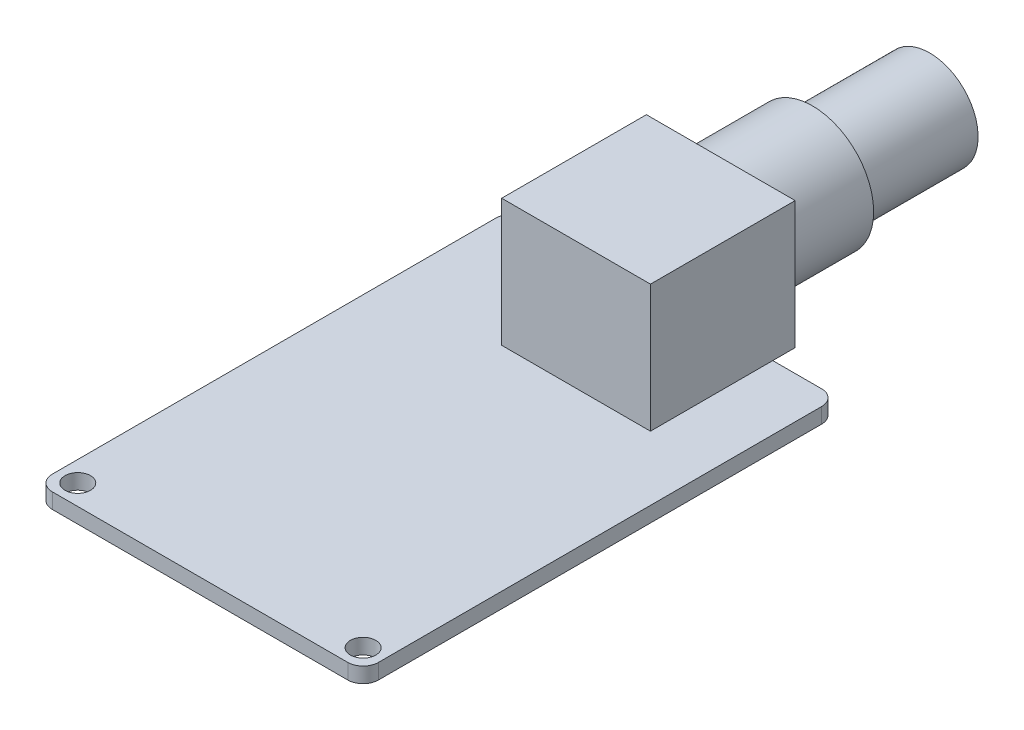
ISO-10303-21;
HEADER;
FILE_DESCRIPTION(('STEP AP214'),'2;1');
FILE_NAME('part.step','',(''),(''),'','','');
FILE_SCHEMA(('AUTOMOTIVE_DESIGN { 1 0 10303 214 1 1 1 1 }'));
ENDSEC;
DATA;
#1=APPLICATION_CONTEXT('core data for automotive mechanical design processes');
#2=APPLICATION_PROTOCOL_DEFINITION('international standard','automotive_design',2000,#1);
#3=PRODUCT_CONTEXT('',#1,'mechanical');
#4=PRODUCT('Part','Part','',(#3));
#5=PRODUCT_RELATED_PRODUCT_CATEGORY('part','',(#4));
#6=PRODUCT_DEFINITION_FORMATION('','',#4);
#7=PRODUCT_DEFINITION_CONTEXT('part definition',#1,'design');
#8=PRODUCT_DEFINITION('design','',#6,#7);
#9=PRODUCT_DEFINITION_SHAPE('','',#8);
#10=(LENGTH_UNIT() NAMED_UNIT(*) SI_UNIT(.MILLI.,.METRE.));
#11=(NAMED_UNIT(*) PLANE_ANGLE_UNIT() SI_UNIT($,.RADIAN.));
#12=(NAMED_UNIT(*) SI_UNIT($,.STERADIAN.) SOLID_ANGLE_UNIT());
#13=UNCERTAINTY_MEASURE_WITH_UNIT(LENGTH_MEASURE(1.E-05),#10,'distance_accuracy_value','');
#14=(GEOMETRIC_REPRESENTATION_CONTEXT(3) GLOBAL_UNCERTAINTY_ASSIGNED_CONTEXT((#13)) GLOBAL_UNIT_ASSIGNED_CONTEXT((#10,
#11,#12)) REPRESENTATION_CONTEXT('',''));
#15=CARTESIAN_POINT('',(0.,0.,0.));
#16=DIRECTION('',(0.,0.,1.));
#17=DIRECTION('',(1.,0.,0.));
#18=AXIS2_PLACEMENT_3D('',#15,#16,#17);
#19=CARTESIAN_POINT('',(-36.6409090909091,25.1,17.7));
#20=DIRECTION('',(0.,1.,0.));
#21=DIRECTION('',(0.,0.,1.));
#22=AXIS2_PLACEMENT_3D('',#19,#20,#21);
#23=PLANE('',#22);
#24=DIRECTION('',(1.,0.,0.));
#25=VECTOR('',#24,1.);
#26=CARTESIAN_POINT('',(-17.2409090909091,25.1,5.69742249083508));
#27=LINE('',#26,#25);
#28=CARTESIAN_POINT('',(-36.6409090909091,25.1,5.69742249083508));
#29=VERTEX_POINT('',#28);
#30=CARTESIAN_POINT('',(-22.0409090909091,25.1,5.69742249083508));
#31=VERTEX_POINT('',#30);
#32=EDGE_CURVE('E11',#29,#31,#27,.T.);
#33=ORIENTED_EDGE('',*,*,#32,.F.);
#34=DIRECTION('',(0.,0.,-1.));
#35=VECTOR('',#34,1.);
#36=CARTESIAN_POINT('',(-36.6409090909091,25.1,17.7));
#37=LINE('',#36,#35);
#38=CARTESIAN_POINT('',(-36.6409090909091,25.1,3.5));
#39=VERTEX_POINT('',#38);
#40=EDGE_CURVE('E191',#29,#39,#37,.T.);
#41=ORIENTED_EDGE('',*,*,#40,.T.);
#42=DIRECTION('',(1.,0.,0.));
#43=VECTOR('',#42,1.);
#44=CARTESIAN_POINT('',(-36.6409090909091,25.1,3.5));
#45=LINE('',#44,#43);
#46=CARTESIAN_POINT('',(-22.0409090909091,25.1,3.5));
#47=VERTEX_POINT('',#46);
#48=EDGE_CURVE('E167',#39,#47,#45,.T.);
#49=ORIENTED_EDGE('',*,*,#48,.T.);
#50=DIRECTION('',(0.,0.,-1.));
#51=VECTOR('',#50,1.);
#52=CARTESIAN_POINT('',(-22.0409090909091,25.1,17.7));
#53=LINE('',#52,#51);
#54=EDGE_CURVE('E188',#31,#47,#53,.T.);
#55=ORIENTED_EDGE('',*,*,#54,.F.);
#56=EDGE_LOOP('',(#33,#41,#49,#55));
#57=FACE_BOUND('',#56,.T.);
#58=ADVANCED_FACE('F32',(#57),#23,.F.);
#59=CARTESIAN_POINT('',(-29.3409090909091,31.5,3.5));
#60=DIRECTION('',(0.,0.,-1.));
#61=DIRECTION('',(-1.,0.,0.));
#62=AXIS2_PLACEMENT_3D('',#59,#60,#61);
#63=CYLINDRICAL_SURFACE('',#62,6.);
#64=CARTESIAN_POINT('',(-29.3409090909091,31.5,3.5));
#65=DIRECTION('',(0.,0.,1.));
#66=DIRECTION('',(1.,0.,0.));
#67=AXIS2_PLACEMENT_3D('',#64,#65,#66);
#68=CIRCLE('',#67,6.);
#69=CARTESIAN_POINT('',(-23.3409090909091,31.5,3.5));
#70=VERTEX_POINT('',#69);
#71=EDGE_CURVE('E36',#70,#70,#68,.T.);
#72=ORIENTED_EDGE('',*,*,#71,.F.);
#73=EDGE_LOOP('',(#72));
#74=FACE_BOUND('',#73,.T.);
#75=CARTESIAN_POINT('',(-29.3409090909091,31.5,-5.5));
#76=DIRECTION('',(0.,0.,1.));
#77=DIRECTION('',(1.,0.,0.));
#78=AXIS2_PLACEMENT_3D('',#75,#76,#77);
#79=CIRCLE('',#78,6.);
#80=CARTESIAN_POINT('',(-23.3409090909091,31.5,-5.5));
#81=VERTEX_POINT('',#80);
#82=EDGE_CURVE('E204',#81,#81,#79,.T.);
#83=ORIENTED_EDGE('',*,*,#82,.T.);
#84=EDGE_LOOP('',(#83));
#85=FACE_BOUND('',#84,.T.);
#86=ADVANCED_FACE('F34',(#74,#85),#63,.T.);
#87=CARTESIAN_POINT('',(-29.3409090909091,31.5,-5.5));
#88=DIRECTION('',(0.,0.,1.));
#89=DIRECTION('',(1.,0.,0.));
#90=AXIS2_PLACEMENT_3D('',#87,#88,#89);
#91=PLANE('',#90);
#92=CARTESIAN_POINT('',(-29.3409090909091,31.5,-5.5));
#93=DIRECTION('',(0.,0.,-1.));
#94=DIRECTION('',(-1.,0.,0.));
#95=AXIS2_PLACEMENT_3D('',#92,#93,#94);
#96=CIRCLE('',#95,4.75000000000001);
#97=CARTESIAN_POINT('',(-34.0909090909091,31.5,-5.5));
#98=VERTEX_POINT('',#97);
#99=EDGE_CURVE('E41',#98,#98,#96,.T.);
#100=ORIENTED_EDGE('',*,*,#99,.F.);
#101=EDGE_LOOP('',(#100));
#102=FACE_BOUND('',#101,.T.);
#103=ORIENTED_EDGE('',*,*,#82,.F.);
#104=EDGE_LOOP('',(#103));
#105=FACE_BOUND('',#104,.T.);
#106=ADVANCED_FACE('F216',(#102,#105),#91,.F.);
#107=CARTESIAN_POINT('',(-29.3409090909091,31.5,-17.));
#108=DIRECTION('',(0.,0.,1.));
#109=DIRECTION('',(1.,0.,0.));
#110=AXIS2_PLACEMENT_3D('',#107,#108,#109);
#111=CYLINDRICAL_SURFACE('',#110,4.75000000000001);
#112=CARTESIAN_POINT('',(-29.3409090909091,31.5,-17.));
#113=DIRECTION('',(0.,0.,-1.));
#114=DIRECTION('',(-1.,0.,0.));
#115=AXIS2_PLACEMENT_3D('',#112,#113,#114);
#116=CIRCLE('',#115,4.75000000000001);
#117=CARTESIAN_POINT('',(-34.0909090909091,31.5,-17.));
#118=VERTEX_POINT('',#117);
#119=EDGE_CURVE('E199',#118,#118,#116,.T.);
#120=ORIENTED_EDGE('',*,*,#119,.F.);
#121=EDGE_LOOP('',(#120));
#122=FACE_BOUND('',#121,.T.);
#123=ORIENTED_EDGE('',*,*,#99,.T.);
#124=EDGE_LOOP('',(#123));
#125=FACE_BOUND('',#124,.T.);
#126=ADVANCED_FACE('F221',(#122,#125),#111,.T.);
#127=CARTESIAN_POINT('',(-29.3409090909091,31.5,-17.));
#128=DIRECTION('',(0.,0.,-1.));
#129=DIRECTION('',(-1.,0.,0.));
#130=AXIS2_PLACEMENT_3D('',#127,#128,#129);
#131=PLANE('',#130);
#132=CARTESIAN_POINT('',(-29.3409090909091,31.5,-17.));
#133=DIRECTION('',(0.,0.,-1.));
#134=DIRECTION('',(-1.,0.,0.));
#135=AXIS2_PLACEMENT_3D('',#132,#133,#134);
#136=CIRCLE('',#135,4.25000000000001);
#137=CARTESIAN_POINT('',(-33.5909090909091,31.5,-17.));
#138=VERTEX_POINT('',#137);
#139=EDGE_CURVE('E195',#138,#138,#136,.T.);
#140=ORIENTED_EDGE('',*,*,#139,.F.);
#141=EDGE_LOOP('',(#140));
#142=FACE_BOUND('',#141,.T.);
#143=ORIENTED_EDGE('',*,*,#119,.T.);
#144=EDGE_LOOP('',(#143));
#145=FACE_BOUND('',#144,.T.);
#146=ADVANCED_FACE('F241',(#142,#145),#131,.T.);
#147=CARTESIAN_POINT('',(-29.3409090909091,31.5,-5.5));
#148=DIRECTION('',(0.,0.,-1.));
#149=DIRECTION('',(-1.,0.,0.));
#150=AXIS2_PLACEMENT_3D('',#147,#148,#149);
#151=CYLINDRICAL_SURFACE('',#150,4.25000000000001);
#152=CARTESIAN_POINT('',(-29.3409090909091,31.5,-5.5));
#153=DIRECTION('',(0.,0.,-1.));
#154=DIRECTION('',(-1.,0.,0.));
#155=AXIS2_PLACEMENT_3D('',#152,#153,#154);
#156=CIRCLE('',#155,4.25000000000001);
#157=CARTESIAN_POINT('',(-33.5909090909091,31.5,-5.5));
#158=VERTEX_POINT('',#157);
#159=EDGE_CURVE('E196',#158,#158,#156,.T.);
#160=ORIENTED_EDGE('',*,*,#159,.F.);
#161=EDGE_LOOP('',(#160));
#162=FACE_BOUND('',#161,.T.);
#163=ORIENTED_EDGE('',*,*,#139,.T.);
#164=EDGE_LOOP('',(#163));
#165=FACE_BOUND('',#164,.T.);
#166=ADVANCED_FACE('F237',(#162,#165),#151,.F.);
#167=CARTESIAN_POINT('',(-29.3409090909091,31.5,-5.5));
#168=DIRECTION('',(0.,0.,-1.));
#169=DIRECTION('',(-1.,0.,0.));
#170=AXIS2_PLACEMENT_3D('',#167,#168,#169);
#171=PLANE('',#170);
#172=ORIENTED_EDGE('',*,*,#159,.T.);
#173=EDGE_LOOP('',(#172));
#174=FACE_BOUND('',#173,.T.);
#175=ADVANCED_FACE('F233',(#174),#171,.T.);
#176=CARTESIAN_POINT('',(-36.6409090909091,37.6,17.7));
#177=DIRECTION('',(1.,0.,0.));
#178=DIRECTION('',(0.,1.,0.));
#179=AXIS2_PLACEMENT_3D('',#176,#177,#178);
#180=PLANE('',#179);
#181=DIRECTION('',(0.,-1.,0.));
#182=VECTOR('',#181,1.);
#183=CARTESIAN_POINT('',(-36.6409090909091,37.6,3.5));
#184=LINE('',#183,#182);
#185=CARTESIAN_POINT('',(-36.6409090909091,37.6,3.5));
#186=VERTEX_POINT('',#185);
#187=EDGE_CURVE('E164',#186,#39,#184,.T.);
#188=ORIENTED_EDGE('',*,*,#187,.T.);
#189=ORIENTED_EDGE('',*,*,#40,.F.);
#190=CARTESIAN_POINT('',(-36.6409090909091,25.1,17.7));
#191=VERTEX_POINT('',#190);
#192=EDGE_CURVE('E192',#191,#29,#37,.T.);
#193=ORIENTED_EDGE('',*,*,#192,.F.);
#194=DIRECTION('',(0.,-1.,0.));
#195=VECTOR('',#194,1.);
#196=CARTESIAN_POINT('',(-36.6409090909091,37.6,17.7));
#197=LINE('',#196,#195);
#198=CARTESIAN_POINT('',(-36.6409090909091,37.6,17.7));
#199=VERTEX_POINT('',#198);
#200=EDGE_CURVE('E83',#199,#191,#197,.T.);
#201=ORIENTED_EDGE('',*,*,#200,.F.);
#202=DIRECTION('',(0.,0.,-1.));
#203=VECTOR('',#202,1.);
#204=CARTESIAN_POINT('',(-36.6409090909091,37.6,17.7));
#205=LINE('',#204,#203);
#206=EDGE_CURVE('E178',#199,#186,#205,.T.);
#207=ORIENTED_EDGE('',*,*,#206,.T.);
#208=EDGE_LOOP('',(#188,#189,#193,#201,#207));
#209=FACE_BOUND('',#208,.T.);
#210=ADVANCED_FACE('F230',(#209),#180,.F.);
#211=CARTESIAN_POINT('',(-22.0409090909091,37.6,17.7));
#212=DIRECTION('',(-1.,0.,0.));
#213=DIRECTION('',(0.,0.,1.));
#214=AXIS2_PLACEMENT_3D('',#211,#212,#213);
#215=PLANE('',#214);
#216=DIRECTION('',(0.,1.,0.));
#217=VECTOR('',#216,1.);
#218=CARTESIAN_POINT('',(-22.0409090909091,37.6,3.5));
#219=LINE('',#218,#217);
#220=CARTESIAN_POINT('',(-22.0409090909091,37.6,3.5));
#221=VERTEX_POINT('',#220);
#222=EDGE_CURVE('E182',#47,#221,#219,.T.);
#223=ORIENTED_EDGE('',*,*,#222,.T.);
#224=DIRECTION('',(0.,0.,-1.));
#225=VECTOR('',#224,1.);
#226=CARTESIAN_POINT('',(-22.0409090909091,37.6,17.7));
#227=LINE('',#226,#225);
#228=CARTESIAN_POINT('',(-22.0409090909091,37.6,17.7));
#229=VERTEX_POINT('',#228);
#230=EDGE_CURVE('E186',#229,#221,#227,.T.);
#231=ORIENTED_EDGE('',*,*,#230,.F.);
#232=DIRECTION('',(0.,1.,0.));
#233=VECTOR('',#232,1.);
#234=CARTESIAN_POINT('',(-22.0409090909091,37.6,17.7));
#235=LINE('',#234,#233);
#236=CARTESIAN_POINT('',(-22.0409090909091,25.1,17.7));
#237=VERTEX_POINT('',#236);
#238=EDGE_CURVE('E176',#237,#229,#235,.T.);
#239=ORIENTED_EDGE('',*,*,#238,.F.);
#240=EDGE_CURVE('E189',#237,#31,#53,.T.);
#241=ORIENTED_EDGE('',*,*,#240,.T.);
#242=ORIENTED_EDGE('',*,*,#54,.T.);
#243=EDGE_LOOP('',(#223,#231,#239,#241,#242));
#244=FACE_BOUND('',#243,.T.);
#245=ADVANCED_FACE('F228',(#244),#215,.F.);
#246=CARTESIAN_POINT('',(-36.6409090909091,37.6,17.7));
#247=DIRECTION('',(0.,-1.,0.));
#248=DIRECTION('',(0.,0.,-1.));
#249=AXIS2_PLACEMENT_3D('',#246,#247,#248);
#250=PLANE('',#249);
#251=DIRECTION('',(-1.,0.,0.));
#252=VECTOR('',#251,1.);
#253=CARTESIAN_POINT('',(-36.6409090909091,37.6,3.5));
#254=LINE('',#253,#252);
#255=EDGE_CURVE('E78',#221,#186,#254,.T.);
#256=ORIENTED_EDGE('',*,*,#255,.T.);
#257=ORIENTED_EDGE('',*,*,#206,.F.);
#258=DIRECTION('',(-1.,0.,0.));
#259=VECTOR('',#258,1.);
#260=CARTESIAN_POINT('',(-36.6409090909091,37.6,17.7));
#261=LINE('',#260,#259);
#262=EDGE_CURVE('E58',#229,#199,#261,.T.);
#263=ORIENTED_EDGE('',*,*,#262,.F.);
#264=ORIENTED_EDGE('',*,*,#230,.T.);
#265=EDGE_LOOP('',(#256,#257,#263,#264));
#266=FACE_BOUND('',#265,.T.);
#267=ADVANCED_FACE('F280',(#266),#250,.F.);
#268=CARTESIAN_POINT('',(0.,0.,17.7));
#269=DIRECTION('',(0.,0.,1.));
#270=DIRECTION('',(1.,0.,0.));
#271=AXIS2_PLACEMENT_3D('',#268,#269,#270);
#272=PLANE('',#271);
#273=ORIENTED_EDGE('',*,*,#200,.T.);
#274=DIRECTION('',(1.,0.,0.));
#275=VECTOR('',#274,1.);
#276=CARTESIAN_POINT('',(-36.6409090909091,25.1,17.7));
#277=LINE('',#276,#275);
#278=EDGE_CURVE('E174',#191,#237,#277,.T.);
#279=ORIENTED_EDGE('',*,*,#278,.T.);
#280=ORIENTED_EDGE('',*,*,#238,.T.);
#281=ORIENTED_EDGE('',*,*,#262,.T.);
#282=EDGE_LOOP('',(#273,#279,#280,#281));
#283=FACE_BOUND('',#282,.T.);
#284=ADVANCED_FACE('F287',(#283),#272,.T.);
#285=CARTESIAN_POINT('',(0.,0.,3.5));
#286=DIRECTION('',(0.,0.,1.));
#287=DIRECTION('',(1.,0.,0.));
#288=AXIS2_PLACEMENT_3D('',#285,#286,#287);
#289=PLANE('',#288);
#290=ORIENTED_EDGE('',*,*,#71,.T.);
#291=EDGE_LOOP('',(#290));
#292=FACE_BOUND('',#291,.T.);
#293=ORIENTED_EDGE('',*,*,#187,.F.);
#294=ORIENTED_EDGE('',*,*,#255,.F.);
#295=ORIENTED_EDGE('',*,*,#222,.F.);
#296=ORIENTED_EDGE('',*,*,#48,.F.);
#297=EDGE_LOOP('',(#293,#294,#295,#296));
#298=FACE_BOUND('',#297,.T.);
#299=ADVANCED_FACE('F212',(#292,#298),#289,.F.);
#300=CARTESIAN_POINT('',(-17.2409090909091,23.6,50.6974224908351));
#301=DIRECTION('',(0.,-1.,0.));
#302=DIRECTION('',(0.,0.,-1.));
#303=AXIS2_PLACEMENT_3D('',#300,#301,#302);
#304=PLANE('',#303);
#305=CARTESIAN_POINT('',(-17.7409090909091,23.6,50.1974224908351));
#306=DIRECTION('',(0.,-1.,0.));
#307=DIRECTION('',(0.,0.,-1.));
#308=AXIS2_PLACEMENT_3D('',#305,#306,#307);
#309=CIRCLE('',#308,1.25);
#310=CARTESIAN_POINT('',(-17.7409090909091,23.6,48.9474224908351));
#311=VERTEX_POINT('',#310);
#312=EDGE_CURVE('E457',#311,#311,#309,.T.);
#313=ORIENTED_EDGE('',*,*,#312,.F.);
#314=EDGE_LOOP('',(#313));
#315=FACE_BOUND('',#314,.T.);
#316=CARTESIAN_POINT('',(-17.2409090909091,23.6,50.6974224908351));
#317=DIRECTION('',(0.,-1.,0.));
#318=DIRECTION('',(0.,0.,-1.));
#319=AXIS2_PLACEMENT_3D('',#316,#317,#318);
#320=CIRCLE('',#319,1.5);
#321=CARTESIAN_POINT('',(-15.7409090909091,23.6,50.6974224908351));
#322=VERTEX_POINT('',#321);
#323=CARTESIAN_POINT('',(-17.2409090909091,23.6,52.1974224908351));
#324=VERTEX_POINT('',#323);
#325=EDGE_CURVE('E149',#322,#324,#320,.T.);
#326=ORIENTED_EDGE('',*,*,#325,.T.);
#327=DIRECTION('',(-1.,0.,0.));
#328=VECTOR('',#327,1.);
#329=CARTESIAN_POINT('',(-17.2409090909091,23.6,52.1974224908351));
#330=LINE('',#329,#328);
#331=CARTESIAN_POINT('',(-46.2409090909091,23.6,52.1974224908351));
#332=VERTEX_POINT('',#331);
#333=EDGE_CURVE('E138',#324,#332,#330,.T.);
#334=ORIENTED_EDGE('',*,*,#333,.T.);
#335=CARTESIAN_POINT('',(-46.2409090909091,23.6,50.6974224908351));
#336=DIRECTION('',(0.,-1.,0.));
#337=DIRECTION('',(0.,0.,-1.));
#338=AXIS2_PLACEMENT_3D('',#335,#336,#337);
#339=CIRCLE('',#338,1.5);
#340=CARTESIAN_POINT('',(-47.7409090909091,23.6,50.6974224908351));
#341=VERTEX_POINT('',#340);
#342=EDGE_CURVE('E148',#332,#341,#339,.T.);
#343=ORIENTED_EDGE('',*,*,#342,.T.);
#344=DIRECTION('',(0.,0.,-1.));
#345=VECTOR('',#344,1.);
#346=CARTESIAN_POINT('',(-47.7409090909091,23.6,7.19742249083508));
#347=LINE('',#346,#345);
#348=CARTESIAN_POINT('',(-47.7409090909091,23.6,7.19742249083508));
#349=VERTEX_POINT('',#348);
#350=EDGE_CURVE('E463',#341,#349,#347,.T.);
#351=ORIENTED_EDGE('',*,*,#350,.T.);
#352=CARTESIAN_POINT('',(-46.2409090909091,23.6,7.19742249083508));
#353=DIRECTION('',(0.,-1.,0.));
#354=DIRECTION('',(0.,0.,1.));
#355=AXIS2_PLACEMENT_3D('',#352,#353,#354);
#356=CIRCLE('',#355,1.5);
#357=CARTESIAN_POINT('',(-46.2409090909091,23.6,5.69742249083507));
#358=VERTEX_POINT('',#357);
#359=EDGE_CURVE('E465',#349,#358,#356,.T.);
#360=ORIENTED_EDGE('',*,*,#359,.T.);
#361=DIRECTION('',(1.,0.,0.));
#362=VECTOR('',#361,1.);
#363=CARTESIAN_POINT('',(-17.2409090909091,23.6,5.69742249083508));
#364=LINE('',#363,#362);
#365=CARTESIAN_POINT('',(-17.2409090909091,23.6,5.69742249083508));
#366=VERTEX_POINT('',#365);
#367=EDGE_CURVE('E467',#358,#366,#364,.T.);
#368=ORIENTED_EDGE('',*,*,#367,.T.);
#369=CARTESIAN_POINT('',(-17.2409090909091,23.6,7.19742249083508));
#370=DIRECTION('',(0.,-1.,0.));
#371=DIRECTION('',(0.,0.,-1.));
#372=AXIS2_PLACEMENT_3D('',#369,#370,#371);
#373=CIRCLE('',#372,1.5);
#374=CARTESIAN_POINT('',(-15.7409090909091,23.6,7.19742249083508));
#375=VERTEX_POINT('',#374);
#376=EDGE_CURVE('E469',#366,#375,#373,.T.);
#377=ORIENTED_EDGE('',*,*,#376,.T.);
#378=DIRECTION('',(0.,0.,1.));
#379=VECTOR('',#378,1.);
#380=CARTESIAN_POINT('',(-15.7409090909091,23.6,7.19742249083508));
#381=LINE('',#380,#379);
#382=EDGE_CURVE('E155',#375,#322,#381,.T.);
#383=ORIENTED_EDGE('',*,*,#382,.T.);
#384=EDGE_LOOP('',(#326,#334,#343,#351,#360,#368,#377,#383));
#385=FACE_BOUND('',#384,.T.);
#386=CARTESIAN_POINT('',(-45.7409090909091,23.6,50.1974224908351));
#387=DIRECTION('',(0.,-1.,0.));
#388=DIRECTION('',(0.,0.,-1.));
#389=AXIS2_PLACEMENT_3D('',#386,#387,#388);
#390=CIRCLE('',#389,1.25);
#391=CARTESIAN_POINT('',(-45.7409090909091,23.6,48.9474224908351));
#392=VERTEX_POINT('',#391);
#393=EDGE_CURVE('E448',#392,#392,#390,.T.);
#394=ORIENTED_EDGE('',*,*,#393,.F.);
#395=EDGE_LOOP('',(#394));
#396=FACE_BOUND('',#395,.T.);
#397=ADVANCED_FACE('F152',(#315,#385,#396),#304,.T.);
#398=CARTESIAN_POINT('',(-17.2409090909091,25.1,50.6974224908351));
#399=DIRECTION('',(0.,-1.,0.));
#400=DIRECTION('',(0.,0.,-1.));
#401=AXIS2_PLACEMENT_3D('',#398,#399,#400);
#402=PLANE('',#401);
#403=ORIENTED_EDGE('',*,*,#240,.F.);
#404=ORIENTED_EDGE('',*,*,#278,.F.);
#405=ORIENTED_EDGE('',*,*,#192,.T.);
#406=CARTESIAN_POINT('',(-46.2409090909091,25.1,5.69742249083507));
#407=VERTEX_POINT('',#406);
#408=EDGE_CURVE('E43',#407,#29,#27,.T.);
#409=ORIENTED_EDGE('',*,*,#408,.F.);
#410=CARTESIAN_POINT('',(-46.2409090909091,25.1,7.19742249083508));
#411=DIRECTION('',(0.,-1.,0.));
#412=DIRECTION('',(0.,0.,1.));
#413=AXIS2_PLACEMENT_3D('',#410,#411,#412);
#414=CIRCLE('',#413,1.5);
#415=CARTESIAN_POINT('',(-47.7409090909091,25.1,7.19742249083508));
#416=VERTEX_POINT('',#415);
#417=EDGE_CURVE('E480',#416,#407,#414,.T.);
#418=ORIENTED_EDGE('',*,*,#417,.F.);
#419=DIRECTION('',(0.,0.,-1.));
#420=VECTOR('',#419,1.);
#421=CARTESIAN_POINT('',(-47.7409090909091,25.1,7.19742249083508));
#422=LINE('',#421,#420);
#423=CARTESIAN_POINT('',(-47.7409090909091,25.1,50.6974224908351));
#424=VERTEX_POINT('',#423);
#425=EDGE_CURVE('E478',#424,#416,#422,.T.);
#426=ORIENTED_EDGE('',*,*,#425,.F.);
#427=CARTESIAN_POINT('',(-46.2409090909091,25.1,50.6974224908351));
#428=DIRECTION('',(0.,-1.,0.));
#429=DIRECTION('',(0.,0.,-1.));
#430=AXIS2_PLACEMENT_3D('',#427,#428,#429);
#431=CIRCLE('',#430,1.5);
#432=CARTESIAN_POINT('',(-46.2409090909091,25.1,52.1974224908351));
#433=VERTEX_POINT('',#432);
#434=EDGE_CURVE('E476',#433,#424,#431,.T.);
#435=ORIENTED_EDGE('',*,*,#434,.F.);
#436=DIRECTION('',(-1.,0.,0.));
#437=VECTOR('',#436,1.);
#438=CARTESIAN_POINT('',(-17.2409090909091,25.1,52.1974224908351));
#439=LINE('',#438,#437);
#440=CARTESIAN_POINT('',(-17.2409090909091,25.1,52.1974224908351));
#441=VERTEX_POINT('',#440);
#442=EDGE_CURVE('E474',#441,#433,#439,.T.);
#443=ORIENTED_EDGE('',*,*,#442,.F.);
#444=CARTESIAN_POINT('',(-17.2409090909091,25.1,50.6974224908351));
#445=DIRECTION('',(0.,-1.,0.));
#446=DIRECTION('',(0.,0.,-1.));
#447=AXIS2_PLACEMENT_3D('',#444,#445,#446);
#448=CIRCLE('',#447,1.5);
#449=CARTESIAN_POINT('',(-15.7409090909091,25.1,50.6974224908351));
#450=VERTEX_POINT('',#449);
#451=EDGE_CURVE('E163',#450,#441,#448,.T.);
#452=ORIENTED_EDGE('',*,*,#451,.F.);
#453=DIRECTION('',(0.,0.,1.));
#454=VECTOR('',#453,1.);
#455=CARTESIAN_POINT('',(-15.7409090909091,25.1,7.19742249083508));
#456=LINE('',#455,#454);
#457=CARTESIAN_POINT('',(-15.7409090909091,25.1,7.19742249083508));
#458=VERTEX_POINT('',#457);
#459=EDGE_CURVE('E159',#458,#450,#456,.T.);
#460=ORIENTED_EDGE('',*,*,#459,.F.);
#461=CARTESIAN_POINT('',(-17.2409090909091,25.1,7.19742249083508));
#462=DIRECTION('',(0.,-1.,0.));
#463=DIRECTION('',(0.,0.,-1.));
#464=AXIS2_PLACEMENT_3D('',#461,#462,#463);
#465=CIRCLE('',#464,1.5);
#466=CARTESIAN_POINT('',(-17.2409090909091,25.1,5.69742249083508));
#467=VERTEX_POINT('',#466);
#468=EDGE_CURVE('E483',#467,#458,#465,.T.);
#469=ORIENTED_EDGE('',*,*,#468,.F.);
#470=EDGE_CURVE('E44',#31,#467,#27,.T.);
#471=ORIENTED_EDGE('',*,*,#470,.F.);
#472=EDGE_LOOP('',(#403,#404,#405,#409,#418,#426,#435,#443,#452,#460,#469,#471));
#473=FACE_BOUND('',#472,.T.);
#474=CARTESIAN_POINT('',(-17.7409090909091,25.1,50.1974224908351));
#475=DIRECTION('',(0.,-1.,0.));
#476=DIRECTION('',(0.,0.,-1.));
#477=AXIS2_PLACEMENT_3D('',#474,#475,#476);
#478=CIRCLE('',#477,1.25);
#479=CARTESIAN_POINT('',(-17.7409090909091,25.1,48.9474224908351));
#480=VERTEX_POINT('',#479);
#481=EDGE_CURVE('E454',#480,#480,#478,.T.);
#482=ORIENTED_EDGE('',*,*,#481,.T.);
#483=EDGE_LOOP('',(#482));
#484=FACE_BOUND('',#483,.T.);
#485=CARTESIAN_POINT('',(-45.7409090909091,25.1,50.1974224908351));
#486=DIRECTION('',(0.,-1.,0.));
#487=DIRECTION('',(0.,0.,-1.));
#488=AXIS2_PLACEMENT_3D('',#485,#486,#487);
#489=CIRCLE('',#488,1.25);
#490=CARTESIAN_POINT('',(-45.7409090909091,25.1,48.9474224908351));
#491=VERTEX_POINT('',#490);
#492=EDGE_CURVE('E451',#491,#491,#489,.T.);
#493=ORIENTED_EDGE('',*,*,#492,.T.);
#494=EDGE_LOOP('',(#493));
#495=FACE_BOUND('',#494,.T.);
#496=ADVANCED_FACE('F304',(#473,#484,#495),#402,.F.);
#497=CARTESIAN_POINT('',(-17.2409090909091,23.6,50.6974224908351));
#498=DIRECTION('',(0.,1.,0.));
#499=DIRECTION('',(0.,0.,1.));
#500=AXIS2_PLACEMENT_3D('',#497,#498,#499);
#501=CYLINDRICAL_SURFACE('',#500,1.5);
#502=ORIENTED_EDGE('',*,*,#451,.T.);
#503=DIRECTION('',(0.,1.,0.));
#504=VECTOR('',#503,1.);
#505=CARTESIAN_POINT('',(-17.2409090909091,23.6,52.1974224908351));
#506=LINE('',#505,#504);
#507=EDGE_CURVE('E142',#324,#441,#506,.T.);
#508=ORIENTED_EDGE('',*,*,#507,.F.);
#509=ORIENTED_EDGE('',*,*,#325,.F.);
#510=DIRECTION('',(0.,1.,0.));
#511=VECTOR('',#510,1.);
#512=CARTESIAN_POINT('',(-15.7409090909091,23.6,50.6974224908351));
#513=LINE('',#512,#511);
#514=EDGE_CURVE('E472',#322,#450,#513,.T.);
#515=ORIENTED_EDGE('',*,*,#514,.T.);
#516=EDGE_LOOP('',(#502,#508,#509,#515));
#517=FACE_BOUND('',#516,.T.);
#518=ADVANCED_FACE('F161',(#517),#501,.T.);
#519=CARTESIAN_POINT('',(-17.2409090909091,23.6,52.1974224908351));
#520=DIRECTION('',(0.,0.,-1.));
#521=DIRECTION('',(-1.,0.,0.));
#522=AXIS2_PLACEMENT_3D('',#519,#520,#521);
#523=PLANE('',#522);
#524=ORIENTED_EDGE('',*,*,#442,.T.);
#525=DIRECTION('',(0.,1.,0.));
#526=VECTOR('',#525,1.);
#527=CARTESIAN_POINT('',(-46.2409090909091,23.6,52.1974224908351));
#528=LINE('',#527,#526);
#529=EDGE_CURVE('E145',#332,#433,#528,.T.);
#530=ORIENTED_EDGE('',*,*,#529,.F.);
#531=ORIENTED_EDGE('',*,*,#333,.F.);
#532=ORIENTED_EDGE('',*,*,#507,.T.);
#533=EDGE_LOOP('',(#524,#530,#531,#532));
#534=FACE_BOUND('',#533,.T.);
#535=ADVANCED_FACE('F140',(#534),#523,.F.);
#536=CARTESIAN_POINT('',(-46.2409090909091,23.6,50.6974224908351));
#537=DIRECTION('',(0.,1.,0.));
#538=DIRECTION('',(0.,0.,1.));
#539=AXIS2_PLACEMENT_3D('',#536,#537,#538);
#540=CYLINDRICAL_SURFACE('',#539,1.5);
#541=ORIENTED_EDGE('',*,*,#434,.T.);
#542=DIRECTION('',(0.,1.,0.));
#543=VECTOR('',#542,1.);
#544=CARTESIAN_POINT('',(-47.7409090909091,23.6,50.6974224908351));
#545=LINE('',#544,#543);
#546=EDGE_CURVE('E169',#341,#424,#545,.T.);
#547=ORIENTED_EDGE('',*,*,#546,.F.);
#548=ORIENTED_EDGE('',*,*,#342,.F.);
#549=ORIENTED_EDGE('',*,*,#529,.T.);
#550=EDGE_LOOP('',(#541,#547,#548,#549));
#551=FACE_BOUND('',#550,.T.);
#552=ADVANCED_FACE('F325',(#551),#540,.T.);
#553=CARTESIAN_POINT('',(-47.7409090909091,23.6,7.19742249083508));
#554=DIRECTION('',(1.,0.,0.));
#555=DIRECTION('',(0.,0.,-1.));
#556=AXIS2_PLACEMENT_3D('',#553,#554,#555);
#557=PLANE('',#556);
#558=ORIENTED_EDGE('',*,*,#425,.T.);
#559=DIRECTION('',(0.,1.,0.));
#560=VECTOR('',#559,1.);
#561=CARTESIAN_POINT('',(-47.7409090909091,23.6,7.19742249083508));
#562=LINE('',#561,#560);
#563=EDGE_CURVE('E496',#349,#416,#562,.T.);
#564=ORIENTED_EDGE('',*,*,#563,.F.);
#565=ORIENTED_EDGE('',*,*,#350,.F.);
#566=ORIENTED_EDGE('',*,*,#546,.T.);
#567=EDGE_LOOP('',(#558,#564,#565,#566));
#568=FACE_BOUND('',#567,.T.);
#569=ADVANCED_FACE('F332',(#568),#557,.F.);
#570=CARTESIAN_POINT('',(-46.2409090909091,23.6,7.19742249083508));
#571=DIRECTION('',(0.,1.,0.));
#572=DIRECTION('',(0.,0.,1.));
#573=AXIS2_PLACEMENT_3D('',#570,#571,#572);
#574=CYLINDRICAL_SURFACE('',#573,1.5);
#575=ORIENTED_EDGE('',*,*,#417,.T.);
#576=DIRECTION('',(0.,1.,0.));
#577=VECTOR('',#576,1.);
#578=CARTESIAN_POINT('',(-46.2409090909091,23.6,5.69742249083507));
#579=LINE('',#578,#577);
#580=EDGE_CURVE('E493',#358,#407,#579,.T.);
#581=ORIENTED_EDGE('',*,*,#580,.F.);
#582=ORIENTED_EDGE('',*,*,#359,.F.);
#583=ORIENTED_EDGE('',*,*,#563,.T.);
#584=EDGE_LOOP('',(#575,#581,#582,#583));
#585=FACE_BOUND('',#584,.T.);
#586=ADVANCED_FACE('F340',(#585),#574,.T.);
#587=CARTESIAN_POINT('',(-17.2409090909091,23.6,5.69742249083508));
#588=DIRECTION('',(0.,0.,1.));
#589=DIRECTION('',(1.,0.,0.));
#590=AXIS2_PLACEMENT_3D('',#587,#588,#589);
#591=PLANE('',#590);
#592=ORIENTED_EDGE('',*,*,#408,.T.);
#593=ORIENTED_EDGE('',*,*,#32,.T.);
#594=ORIENTED_EDGE('',*,*,#470,.T.);
#595=DIRECTION('',(0.,1.,0.));
#596=VECTOR('',#595,1.);
#597=CARTESIAN_POINT('',(-17.2409090909091,23.6,5.69742249083508));
#598=LINE('',#597,#596);
#599=EDGE_CURVE('E490',#366,#467,#598,.T.);
#600=ORIENTED_EDGE('',*,*,#599,.F.);
#601=ORIENTED_EDGE('',*,*,#367,.F.);
#602=ORIENTED_EDGE('',*,*,#580,.T.);
#603=EDGE_LOOP('',(#592,#593,#594,#600,#601,#602));
#604=FACE_BOUND('',#603,.T.);
#605=ADVANCED_FACE('F348',(#604),#591,.F.);
#606=CARTESIAN_POINT('',(-17.2409090909091,23.6,7.19742249083508));
#607=DIRECTION('',(0.,1.,0.));
#608=DIRECTION('',(0.,0.,1.));
#609=AXIS2_PLACEMENT_3D('',#606,#607,#608);
#610=CYLINDRICAL_SURFACE('',#609,1.5);
#611=ORIENTED_EDGE('',*,*,#468,.T.);
#612=DIRECTION('',(0.,1.,0.));
#613=VECTOR('',#612,1.);
#614=CARTESIAN_POINT('',(-15.7409090909091,23.6,7.19742249083508));
#615=LINE('',#614,#613);
#616=EDGE_CURVE('E487',#375,#458,#615,.T.);
#617=ORIENTED_EDGE('',*,*,#616,.F.);
#618=ORIENTED_EDGE('',*,*,#376,.F.);
#619=ORIENTED_EDGE('',*,*,#599,.T.);
#620=EDGE_LOOP('',(#611,#617,#618,#619));
#621=FACE_BOUND('',#620,.T.);
#622=ADVANCED_FACE('F356',(#621),#610,.T.);
#623=CARTESIAN_POINT('',(-15.7409090909091,23.6,7.19742249083508));
#624=DIRECTION('',(-1.,0.,0.));
#625=DIRECTION('',(0.,0.,1.));
#626=AXIS2_PLACEMENT_3D('',#623,#624,#625);
#627=PLANE('',#626);
#628=ORIENTED_EDGE('',*,*,#459,.T.);
#629=ORIENTED_EDGE('',*,*,#514,.F.);
#630=ORIENTED_EDGE('',*,*,#382,.F.);
#631=ORIENTED_EDGE('',*,*,#616,.T.);
#632=EDGE_LOOP('',(#628,#629,#630,#631));
#633=FACE_BOUND('',#632,.T.);
#634=ADVANCED_FACE('F364',(#633),#627,.F.);
#635=CARTESIAN_POINT('',(-17.7409090909091,23.6,50.1974224908351));
#636=DIRECTION('',(0.,1.,0.));
#637=DIRECTION('',(0.,0.,1.));
#638=AXIS2_PLACEMENT_3D('',#635,#636,#637);
#639=CYLINDRICAL_SURFACE('',#638,1.25);
#640=ORIENTED_EDGE('',*,*,#312,.T.);
#641=EDGE_LOOP('',(#640));
#642=FACE_BOUND('',#641,.T.);
#643=ORIENTED_EDGE('',*,*,#481,.F.);
#644=EDGE_LOOP('',(#643));
#645=FACE_BOUND('',#644,.T.);
#646=ADVANCED_FACE('F372',(#642,#645),#639,.F.);
#647=CARTESIAN_POINT('',(-45.7409090909091,23.6,50.1974224908351));
#648=DIRECTION('',(0.,1.,0.));
#649=DIRECTION('',(0.,0.,1.));
#650=AXIS2_PLACEMENT_3D('',#647,#648,#649);
#651=CYLINDRICAL_SURFACE('',#650,1.25);
#652=ORIENTED_EDGE('',*,*,#393,.T.);
#653=EDGE_LOOP('',(#652));
#654=FACE_BOUND('',#653,.T.);
#655=ORIENTED_EDGE('',*,*,#492,.F.);
#656=EDGE_LOOP('',(#655));
#657=FACE_BOUND('',#656,.T.);
#658=ADVANCED_FACE('F380',(#654,#657),#651,.F.);
#659=CLOSED_SHELL('',(#58,#86,#106,#126,#146,#166,#175,#210,#245,#267,#284,#299,#397,#496,#518,
#535,#552,#569,#586,#605,#622,#634,#646,#658));
#660=MANIFOLD_SOLID_BREP('B2',#659);
#661=ADVANCED_BREP_SHAPE_REPRESENTATION('',(#18,#660),#14);
#662=SHAPE_DEFINITION_REPRESENTATION(#9,#661);
ENDSEC;
END-ISO-10303-21;
